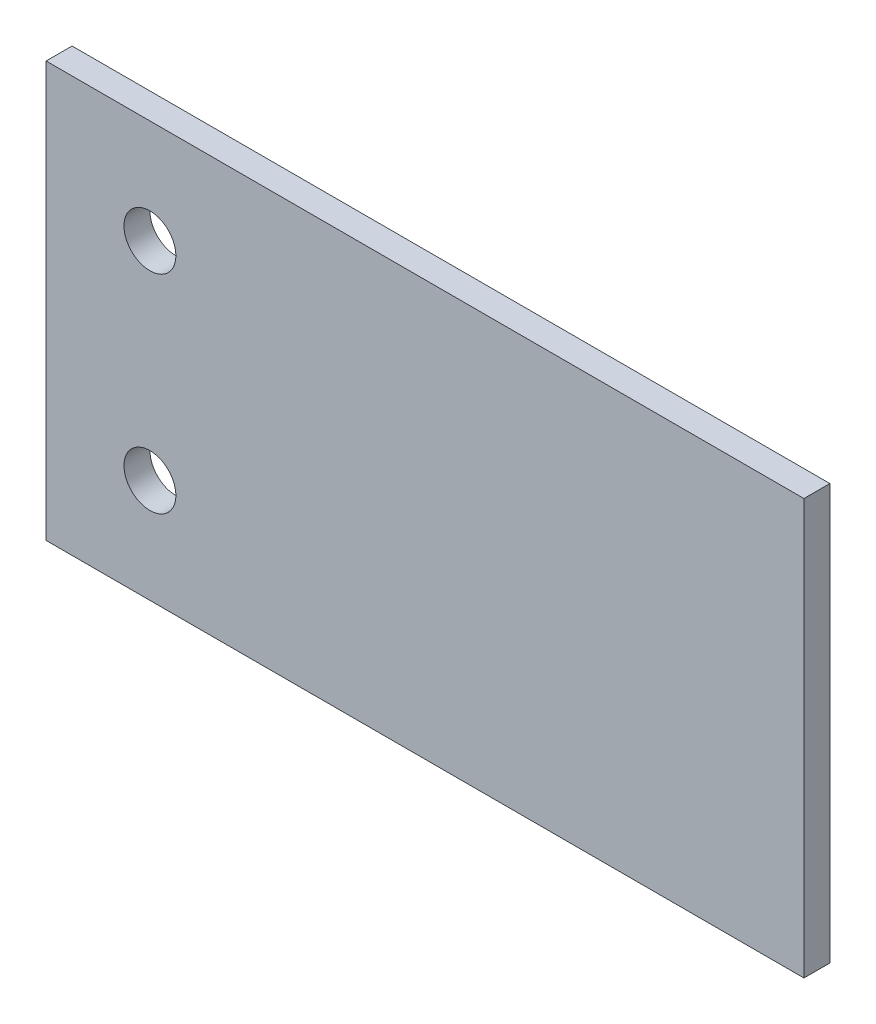
ISO-10303-21;
HEADER;
FILE_DESCRIPTION(('STEP AP214'),'2;1');
FILE_NAME('part.step','',(''),(''),'','','');
FILE_SCHEMA(('AUTOMOTIVE_DESIGN { 1 0 10303 214 1 1 1 1 }'));
ENDSEC;
DATA;
#1=APPLICATION_CONTEXT('core data for automotive mechanical design processes');
#2=APPLICATION_PROTOCOL_DEFINITION('international standard','automotive_design',2000,#1);
#3=PRODUCT_CONTEXT('',#1,'mechanical');
#4=PRODUCT('Part','Part','',(#3));
#5=PRODUCT_RELATED_PRODUCT_CATEGORY('part','',(#4));
#6=PRODUCT_DEFINITION_FORMATION('','',#4);
#7=PRODUCT_DEFINITION_CONTEXT('part definition',#1,'design');
#8=PRODUCT_DEFINITION('design','',#6,#7);
#9=PRODUCT_DEFINITION_SHAPE('','',#8);
#10=(LENGTH_UNIT() NAMED_UNIT(*) SI_UNIT(.MILLI.,.METRE.));
#11=(NAMED_UNIT(*) PLANE_ANGLE_UNIT() SI_UNIT($,.RADIAN.));
#12=(NAMED_UNIT(*) SI_UNIT($,.STERADIAN.) SOLID_ANGLE_UNIT());
#13=UNCERTAINTY_MEASURE_WITH_UNIT(LENGTH_MEASURE(1.E-05),#10,'distance_accuracy_value','');
#14=(GEOMETRIC_REPRESENTATION_CONTEXT(3) GLOBAL_UNCERTAINTY_ASSIGNED_CONTEXT((#13)) GLOBAL_UNIT_ASSIGNED_CONTEXT((#10,
#11,#12)) REPRESENTATION_CONTEXT('',''));
#15=CARTESIAN_POINT('',(0.,0.,0.));
#16=DIRECTION('',(0.,0.,1.));
#17=DIRECTION('',(1.,0.,0.));
#18=AXIS2_PLACEMENT_3D('',#15,#16,#17);
#19=CARTESIAN_POINT('',(0.,0.,3.175));
#20=DIRECTION('',(0.,0.,-1.));
#21=DIRECTION('',(-1.,0.,0.));
#22=AXIS2_PLACEMENT_3D('',#19,#20,#21);
#23=PLANE('',#22);
#24=DIRECTION('',(0.,-1.,0.));
#25=VECTOR('',#24,1.);
#26=CARTESIAN_POINT('',(0.,0.,3.175));
#27=LINE('',#26,#25);
#28=CARTESIAN_POINT('',(0.,50.8,3.175));
#29=VERTEX_POINT('',#28);
#30=CARTESIAN_POINT('',(0.,0.,3.175));
#31=VERTEX_POINT('',#30);
#32=EDGE_CURVE('E85',#29,#31,#27,.T.);
#33=ORIENTED_EDGE('',*,*,#32,.T.);
#34=DIRECTION('',(1.,0.,0.));
#35=VECTOR('',#34,1.);
#36=CARTESIAN_POINT('',(0.,0.,3.175));
#37=LINE('',#36,#35);
#38=CARTESIAN_POINT('',(92.71,0.,3.175));
#39=VERTEX_POINT('',#38);
#40=EDGE_CURVE('E80',#31,#39,#37,.T.);
#41=ORIENTED_EDGE('',*,*,#40,.T.);
#42=DIRECTION('',(0.,1.,0.));
#43=VECTOR('',#42,1.);
#44=CARTESIAN_POINT('',(92.71,0.,3.175));
#45=LINE('',#44,#43);
#46=CARTESIAN_POINT('',(92.71,50.8,3.175));
#47=VERTEX_POINT('',#46);
#48=EDGE_CURVE('E83',#39,#47,#45,.T.);
#49=ORIENTED_EDGE('',*,*,#48,.T.);
#50=DIRECTION('',(-1.,0.,0.));
#51=VECTOR('',#50,1.);
#52=CARTESIAN_POINT('',(0.,50.8,3.175));
#53=LINE('',#52,#51);
#54=EDGE_CURVE('E50',#47,#29,#53,.T.);
#55=ORIENTED_EDGE('',*,*,#54,.T.);
#56=EDGE_LOOP('',(#33,#41,#49,#55));
#57=FACE_BOUND('',#56,.T.);
#58=CARTESIAN_POINT('',(12.7,38.1,3.175));
#59=DIRECTION('',(0.,0.,1.));
#60=DIRECTION('',(1.,0.,0.));
#61=AXIS2_PLACEMENT_3D('',#58,#59,#60);
#62=CIRCLE('',#61,3.175);
#63=CARTESIAN_POINT('',(15.875,38.1,3.175));
#64=VERTEX_POINT('',#63);
#65=EDGE_CURVE('E100',#64,#64,#62,.T.);
#66=ORIENTED_EDGE('',*,*,#65,.F.);
#67=EDGE_LOOP('',(#66));
#68=FACE_BOUND('',#67,.T.);
#69=CARTESIAN_POINT('',(12.7,12.7,3.175));
#70=DIRECTION('',(0.,0.,1.));
#71=DIRECTION('',(1.,0.,0.));
#72=AXIS2_PLACEMENT_3D('',#69,#70,#71);
#73=CIRCLE('',#72,3.175);
#74=CARTESIAN_POINT('',(15.875,12.7,3.175));
#75=VERTEX_POINT('',#74);
#76=EDGE_CURVE('E115',#75,#75,#73,.T.);
#77=ORIENTED_EDGE('',*,*,#76,.F.);
#78=EDGE_LOOP('',(#77));
#79=FACE_BOUND('',#78,.T.);
#80=ADVANCED_FACE('F33',(#57,#68,#79),#23,.F.);
#81=CARTESIAN_POINT('',(0.,0.,0.));
#82=DIRECTION('',(0.,0.,-1.));
#83=DIRECTION('',(-1.,0.,0.));
#84=AXIS2_PLACEMENT_3D('',#81,#82,#83);
#85=PLANE('',#84);
#86=CARTESIAN_POINT('',(12.7,38.1,0.));
#87=DIRECTION('',(0.,0.,1.));
#88=DIRECTION('',(1.,0.,0.));
#89=AXIS2_PLACEMENT_3D('',#86,#87,#88);
#90=CIRCLE('',#89,3.175);
#91=CARTESIAN_POINT('',(15.875,38.1,0.));
#92=VERTEX_POINT('',#91);
#93=EDGE_CURVE('E112',#92,#92,#90,.T.);
#94=ORIENTED_EDGE('',*,*,#93,.T.);
#95=EDGE_LOOP('',(#94));
#96=FACE_BOUND('',#95,.T.);
#97=DIRECTION('',(0.,-1.,0.));
#98=VECTOR('',#97,1.);
#99=CARTESIAN_POINT('',(0.,0.,0.));
#100=LINE('',#99,#98);
#101=CARTESIAN_POINT('',(0.,50.8,0.));
#102=VERTEX_POINT('',#101);
#103=CARTESIAN_POINT('',(0.,0.,0.));
#104=VERTEX_POINT('',#103);
#105=EDGE_CURVE('E97',#102,#104,#100,.T.);
#106=ORIENTED_EDGE('',*,*,#105,.F.);
#107=DIRECTION('',(-1.,0.,0.));
#108=VECTOR('',#107,1.);
#109=CARTESIAN_POINT('',(0.,50.8,0.));
#110=LINE('',#109,#108);
#111=CARTESIAN_POINT('',(92.71,50.8,0.));
#112=VERTEX_POINT('',#111);
#113=EDGE_CURVE('E73',#112,#102,#110,.T.);
#114=ORIENTED_EDGE('',*,*,#113,.F.);
#115=DIRECTION('',(0.,1.,0.));
#116=VECTOR('',#115,1.);
#117=CARTESIAN_POINT('',(92.71,0.,0.));
#118=LINE('',#117,#116);
#119=CARTESIAN_POINT('',(92.71,0.,0.));
#120=VERTEX_POINT('',#119);
#121=EDGE_CURVE('E67',#120,#112,#118,.T.);
#122=ORIENTED_EDGE('',*,*,#121,.F.);
#123=DIRECTION('',(1.,0.,0.));
#124=VECTOR('',#123,1.);
#125=CARTESIAN_POINT('',(0.,0.,0.));
#126=LINE('',#125,#124);
#127=EDGE_CURVE('E89',#104,#120,#126,.T.);
#128=ORIENTED_EDGE('',*,*,#127,.F.);
#129=EDGE_LOOP('',(#106,#114,#122,#128));
#130=FACE_BOUND('',#129,.T.);
#131=CARTESIAN_POINT('',(12.7,12.7,0.));
#132=DIRECTION('',(0.,0.,1.));
#133=DIRECTION('',(1.,0.,0.));
#134=AXIS2_PLACEMENT_3D('',#131,#132,#133);
#135=CIRCLE('',#134,3.175);
#136=CARTESIAN_POINT('',(15.875,12.7,0.));
#137=VERTEX_POINT('',#136);
#138=EDGE_CURVE('E118',#137,#137,#135,.T.);
#139=ORIENTED_EDGE('',*,*,#138,.T.);
#140=EDGE_LOOP('',(#139));
#141=FACE_BOUND('',#140,.T.);
#142=ADVANCED_FACE('F108',(#96,#130,#141),#85,.T.);
#143=CARTESIAN_POINT('',(0.,0.,3.175));
#144=DIRECTION('',(1.,0.,0.));
#145=DIRECTION('',(0.,0.,-1.));
#146=AXIS2_PLACEMENT_3D('',#143,#144,#145);
#147=PLANE('',#146);
#148=ORIENTED_EDGE('',*,*,#105,.T.);
#149=DIRECTION('',(0.,0.,-1.));
#150=VECTOR('',#149,1.);
#151=CARTESIAN_POINT('',(0.,0.,3.175));
#152=LINE('',#151,#150);
#153=EDGE_CURVE('E11',#31,#104,#152,.T.);
#154=ORIENTED_EDGE('',*,*,#153,.F.);
#155=ORIENTED_EDGE('',*,*,#32,.F.);
#156=DIRECTION('',(0.,0.,-1.));
#157=VECTOR('',#156,1.);
#158=CARTESIAN_POINT('',(0.,50.8,3.175));
#159=LINE('',#158,#157);
#160=EDGE_CURVE('E93',#29,#102,#159,.T.);
#161=ORIENTED_EDGE('',*,*,#160,.T.);
#162=EDGE_LOOP('',(#148,#154,#155,#161));
#163=FACE_BOUND('',#162,.T.);
#164=ADVANCED_FACE('F35',(#163),#147,.F.);
#165=CARTESIAN_POINT('',(0.,0.,3.175));
#166=DIRECTION('',(0.,1.,0.));
#167=DIRECTION('',(0.,0.,1.));
#168=AXIS2_PLACEMENT_3D('',#165,#166,#167);
#169=PLANE('',#168);
#170=ORIENTED_EDGE('',*,*,#127,.T.);
#171=DIRECTION('',(0.,0.,-1.));
#172=VECTOR('',#171,1.);
#173=CARTESIAN_POINT('',(92.71,0.,3.175));
#174=LINE('',#173,#172);
#175=EDGE_CURVE('E42',#39,#120,#174,.T.);
#176=ORIENTED_EDGE('',*,*,#175,.F.);
#177=ORIENTED_EDGE('',*,*,#40,.F.);
#178=ORIENTED_EDGE('',*,*,#153,.T.);
#179=EDGE_LOOP('',(#170,#176,#177,#178));
#180=FACE_BOUND('',#179,.T.);
#181=ADVANCED_FACE('F88',(#180),#169,.F.);
#182=CARTESIAN_POINT('',(92.71,0.,3.175));
#183=DIRECTION('',(-1.,0.,0.));
#184=DIRECTION('',(0.,0.,1.));
#185=AXIS2_PLACEMENT_3D('',#182,#183,#184);
#186=PLANE('',#185);
#187=ORIENTED_EDGE('',*,*,#121,.T.);
#188=DIRECTION('',(0.,0.,-1.));
#189=VECTOR('',#188,1.);
#190=CARTESIAN_POINT('',(92.71,50.8,3.175));
#191=LINE('',#190,#189);
#192=EDGE_CURVE('E90',#47,#112,#191,.T.);
#193=ORIENTED_EDGE('',*,*,#192,.F.);
#194=ORIENTED_EDGE('',*,*,#48,.F.);
#195=ORIENTED_EDGE('',*,*,#175,.T.);
#196=EDGE_LOOP('',(#187,#193,#194,#195));
#197=FACE_BOUND('',#196,.T.);
#198=ADVANCED_FACE('F91',(#197),#186,.F.);
#199=CARTESIAN_POINT('',(0.,50.8,3.175));
#200=DIRECTION('',(0.,-1.,0.));
#201=DIRECTION('',(0.,0.,-1.));
#202=AXIS2_PLACEMENT_3D('',#199,#200,#201);
#203=PLANE('',#202);
#204=ORIENTED_EDGE('',*,*,#113,.T.);
#205=ORIENTED_EDGE('',*,*,#160,.F.);
#206=ORIENTED_EDGE('',*,*,#54,.F.);
#207=ORIENTED_EDGE('',*,*,#192,.T.);
#208=EDGE_LOOP('',(#204,#205,#206,#207));
#209=FACE_BOUND('',#208,.T.);
#210=ADVANCED_FACE('F105',(#209),#203,.F.);
#211=CARTESIAN_POINT('',(12.7,38.1,3.175));
#212=DIRECTION('',(0.,0.,-1.));
#213=DIRECTION('',(-1.,0.,0.));
#214=AXIS2_PLACEMENT_3D('',#211,#212,#213);
#215=CYLINDRICAL_SURFACE('',#214,3.175);
#216=ORIENTED_EDGE('',*,*,#65,.T.);
#217=EDGE_LOOP('',(#216));
#218=FACE_BOUND('',#217,.T.);
#219=ORIENTED_EDGE('',*,*,#93,.F.);
#220=EDGE_LOOP('',(#219));
#221=FACE_BOUND('',#220,.T.);
#222=ADVANCED_FACE('F135',(#218,#221),#215,.F.);
#223=CARTESIAN_POINT('',(12.7,12.7,3.175));
#224=DIRECTION('',(0.,0.,-1.));
#225=DIRECTION('',(-1.,0.,0.));
#226=AXIS2_PLACEMENT_3D('',#223,#224,#225);
#227=CYLINDRICAL_SURFACE('',#226,3.175);
#228=ORIENTED_EDGE('',*,*,#76,.T.);
#229=EDGE_LOOP('',(#228));
#230=FACE_BOUND('',#229,.T.);
#231=ORIENTED_EDGE('',*,*,#138,.F.);
#232=EDGE_LOOP('',(#231));
#233=FACE_BOUND('',#232,.T.);
#234=ADVANCED_FACE('F124',(#230,#233),#227,.F.);
#235=CLOSED_SHELL('',(#80,#142,#164,#181,#198,#210,#222,#234));
#236=MANIFOLD_SOLID_BREP('B2',#235);
#237=ADVANCED_BREP_SHAPE_REPRESENTATION('',(#18,#236),#14);
#238=SHAPE_DEFINITION_REPRESENTATION(#9,#237);
ENDSEC;
END-ISO-10303-21;
